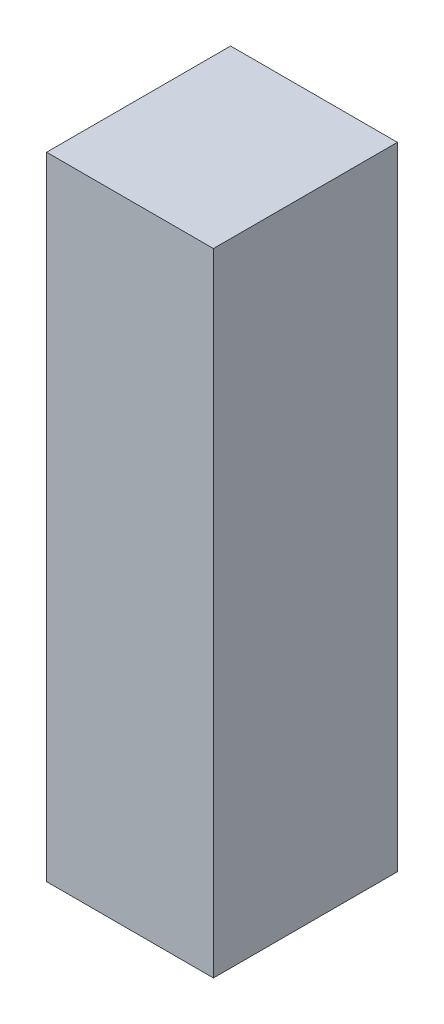
ISO-10303-21;
HEADER;
FILE_DESCRIPTION(('STEP AP214'),'2;1');
FILE_NAME('part.step','',(''),(''),'','','');
FILE_SCHEMA(('AUTOMOTIVE_DESIGN { 1 0 10303 214 1 1 1 1 }'));
ENDSEC;
DATA;
#1=APPLICATION_CONTEXT('core data for automotive mechanical design processes');
#2=APPLICATION_PROTOCOL_DEFINITION('international standard','automotive_design',2000,#1);
#3=PRODUCT_CONTEXT('',#1,'mechanical');
#4=PRODUCT('Part','Part','',(#3));
#5=PRODUCT_RELATED_PRODUCT_CATEGORY('part','',(#4));
#6=PRODUCT_DEFINITION_FORMATION('','',#4);
#7=PRODUCT_DEFINITION_CONTEXT('part definition',#1,'design');
#8=PRODUCT_DEFINITION('design','',#6,#7);
#9=PRODUCT_DEFINITION_SHAPE('','',#8);
#10=(LENGTH_UNIT() NAMED_UNIT(*) SI_UNIT(.MILLI.,.METRE.));
#11=(NAMED_UNIT(*) PLANE_ANGLE_UNIT() SI_UNIT($,.RADIAN.));
#12=(NAMED_UNIT(*) SI_UNIT($,.STERADIAN.) SOLID_ANGLE_UNIT());
#13=UNCERTAINTY_MEASURE_WITH_UNIT(LENGTH_MEASURE(1.E-05),#10,'distance_accuracy_value','');
#14=(GEOMETRIC_REPRESENTATION_CONTEXT(3) GLOBAL_UNCERTAINTY_ASSIGNED_CONTEXT((#13)) GLOBAL_UNIT_ASSIGNED_CONTEXT((#10,
#11,#12)) REPRESENTATION_CONTEXT('',''));
#15=CARTESIAN_POINT('',(0.,0.,0.));
#16=DIRECTION('',(0.,0.,1.));
#17=DIRECTION('',(1.,0.,0.));
#18=AXIS2_PLACEMENT_3D('',#15,#16,#17);
#19=CARTESIAN_POINT('',(107.3500013524,41.8789091554,102.779430458));
#20=DIRECTION('',(0.,0.,-1.));
#21=DIRECTION('',(-1.,0.,0.));
#22=AXIS2_PLACEMENT_3D('',#19,#20,#21);
#23=PLANE('',#22);
#24=DIRECTION('',(1.,0.,0.));
#25=VECTOR('',#24,1.);
#26=CARTESIAN_POINT('',(106.6947078319,46.8419278552,102.779430458));
#27=LINE('',#26,#25);
#28=CARTESIAN_POINT('',(106.0394143114,46.8419278552,102.779430458));
#29=VERTEX_POINT('',#28);
#30=CARTESIAN_POINT('',(107.3500013524,46.8419278552,102.779430458));
#31=VERTEX_POINT('',#30);
#32=EDGE_CURVE('E56',#29,#31,#27,.T.);
#33=ORIENTED_EDGE('',*,*,#32,.T.);
#34=DIRECTION('',(0.,1.,0.));
#35=VECTOR('',#34,1.);
#36=CARTESIAN_POINT('',(107.3500013524,44.3604185053,102.779430458));
#37=LINE('',#36,#35);
#38=CARTESIAN_POINT('',(107.3500013524,41.8789091554,102.779430458));
#39=VERTEX_POINT('',#38);
#40=EDGE_CURVE('E61',#39,#31,#37,.T.);
#41=ORIENTED_EDGE('',*,*,#40,.F.);
#42=DIRECTION('',(-1.,0.,0.));
#43=VECTOR('',#42,1.);
#44=CARTESIAN_POINT('',(106.6947078319,41.8789091554,102.779430458));
#45=LINE('',#44,#43);
#46=CARTESIAN_POINT('',(106.0394143114,41.8789091554,102.779430458));
#47=VERTEX_POINT('',#46);
#48=EDGE_CURVE('E21',#39,#47,#45,.T.);
#49=ORIENTED_EDGE('',*,*,#48,.T.);
#50=DIRECTION('',(0.,-1.,0.));
#51=VECTOR('',#50,1.);
#52=CARTESIAN_POINT('',(106.0394143114,44.3604185053,102.779430458));
#53=LINE('',#52,#51);
#54=EDGE_CURVE('E77',#29,#47,#53,.T.);
#55=ORIENTED_EDGE('',*,*,#54,.F.);
#56=EDGE_LOOP('',(#33,#41,#49,#55));
#57=FACE_BOUND('',#56,.T.);
#58=ADVANCED_FACE('F17',(#57),#23,.T.);
#59=CARTESIAN_POINT('',(107.3500013524,41.8789091554,104.224839683));
#60=DIRECTION('',(1.,0.,0.));
#61=DIRECTION('',(0.,0.,-1.));
#62=AXIS2_PLACEMENT_3D('',#59,#60,#61);
#63=PLANE('',#62);
#64=DIRECTION('',(0.,0.,1.));
#65=VECTOR('',#64,1.);
#66=CARTESIAN_POINT('',(107.3500013524,46.8419278552,103.5021350705));
#67=LINE('',#66,#65);
#68=CARTESIAN_POINT('',(107.3500013524,46.8419278552,104.224839683));
#69=VERTEX_POINT('',#68);
#70=EDGE_CURVE('E71',#31,#69,#67,.T.);
#71=ORIENTED_EDGE('',*,*,#70,.T.);
#72=DIRECTION('',(0.,1.,0.));
#73=VECTOR('',#72,1.);
#74=CARTESIAN_POINT('',(107.3500013524,44.3604185053,104.224839683));
#75=LINE('',#74,#73);
#76=CARTESIAN_POINT('',(107.3500013524,41.8789091554,104.224839683));
#77=VERTEX_POINT('',#76);
#78=EDGE_CURVE('E67',#77,#69,#75,.T.);
#79=ORIENTED_EDGE('',*,*,#78,.F.);
#80=DIRECTION('',(0.,0.,-1.));
#81=VECTOR('',#80,1.);
#82=CARTESIAN_POINT('',(107.3500013524,41.8789091554,103.5021350705));
#83=LINE('',#82,#81);
#84=EDGE_CURVE('E35',#77,#39,#83,.T.);
#85=ORIENTED_EDGE('',*,*,#84,.T.);
#86=ORIENTED_EDGE('',*,*,#40,.T.);
#87=EDGE_LOOP('',(#71,#79,#85,#86));
#88=FACE_BOUND('',#87,.T.);
#89=ADVANCED_FACE('F65',(#88),#63,.T.);
#90=CARTESIAN_POINT('',(106.0394143114,46.8419278552,102.779430458));
#91=DIRECTION('',(0.,-1.,0.));
#92=DIRECTION('',(1.,0.,0.));
#93=AXIS2_PLACEMENT_3D('',#90,#91,#92);
#94=PLANE('',#93);
#95=ORIENTED_EDGE('',*,*,#32,.F.);
#96=DIRECTION('',(0.,0.,-1.));
#97=VECTOR('',#96,1.);
#98=CARTESIAN_POINT('',(106.0394143114,46.8419278552,103.5021350705));
#99=LINE('',#98,#97);
#100=CARTESIAN_POINT('',(106.0394143114,46.8419278552,104.224839683));
#101=VERTEX_POINT('',#100);
#102=EDGE_CURVE('E74',#101,#29,#99,.T.);
#103=ORIENTED_EDGE('',*,*,#102,.F.);
#104=DIRECTION('',(-1.,0.,0.));
#105=VECTOR('',#104,1.);
#106=CARTESIAN_POINT('',(106.6947078319,46.8419278552,104.224839683));
#107=LINE('',#106,#105);
#108=EDGE_CURVE('E80',#69,#101,#107,.T.);
#109=ORIENTED_EDGE('',*,*,#108,.F.);
#110=ORIENTED_EDGE('',*,*,#70,.F.);
#111=EDGE_LOOP('',(#95,#103,#109,#110));
#112=FACE_BOUND('',#111,.T.);
#113=ADVANCED_FACE('F91',(#112),#94,.F.);
#114=CARTESIAN_POINT('',(106.0394143114,41.8789091554,102.779430458));
#115=DIRECTION('',(-1.,0.,0.));
#116=DIRECTION('',(0.,0.,1.));
#117=AXIS2_PLACEMENT_3D('',#114,#115,#116);
#118=PLANE('',#117);
#119=ORIENTED_EDGE('',*,*,#102,.T.);
#120=ORIENTED_EDGE('',*,*,#54,.T.);
#121=DIRECTION('',(0.,0.,1.));
#122=VECTOR('',#121,1.);
#123=CARTESIAN_POINT('',(106.0394143114,41.8789091554,103.5021350705));
#124=LINE('',#123,#122);
#125=CARTESIAN_POINT('',(106.0394143114,41.8789091554,104.224839683));
#126=VERTEX_POINT('',#125);
#127=EDGE_CURVE('E59',#47,#126,#124,.T.);
#128=ORIENTED_EDGE('',*,*,#127,.T.);
#129=DIRECTION('',(0.,-1.,0.));
#130=VECTOR('',#129,1.);
#131=CARTESIAN_POINT('',(106.0394143114,44.3604185053,104.224839683));
#132=LINE('',#131,#130);
#133=EDGE_CURVE('E27',#101,#126,#132,.T.);
#134=ORIENTED_EDGE('',*,*,#133,.F.);
#135=EDGE_LOOP('',(#119,#120,#128,#134));
#136=FACE_BOUND('',#135,.T.);
#137=ADVANCED_FACE('F89',(#136),#118,.T.);
#138=CARTESIAN_POINT('',(106.0394143114,41.8789091554,104.224839683));
#139=DIRECTION('',(0.,0.,1.));
#140=DIRECTION('',(1.,0.,0.));
#141=AXIS2_PLACEMENT_3D('',#138,#139,#140);
#142=PLANE('',#141);
#143=ORIENTED_EDGE('',*,*,#108,.T.);
#144=ORIENTED_EDGE('',*,*,#133,.T.);
#145=DIRECTION('',(-1.,0.,0.));
#146=VECTOR('',#145,1.);
#147=CARTESIAN_POINT('',(106.6947078319,41.8789091554,104.224839683));
#148=LINE('',#147,#146);
#149=EDGE_CURVE('E11',#77,#126,#148,.T.);
#150=ORIENTED_EDGE('',*,*,#149,.F.);
#151=ORIENTED_EDGE('',*,*,#78,.T.);
#152=EDGE_LOOP('',(#143,#144,#150,#151));
#153=FACE_BOUND('',#152,.T.);
#154=ADVANCED_FACE('F86',(#153),#142,.T.);
#155=CARTESIAN_POINT('',(106.0394143114,41.8789091554,104.224839683));
#156=DIRECTION('',(0.,-1.,0.));
#157=DIRECTION('',(0.,0.,-1.));
#158=AXIS2_PLACEMENT_3D('',#155,#156,#157);
#159=PLANE('',#158);
#160=ORIENTED_EDGE('',*,*,#84,.F.);
#161=ORIENTED_EDGE('',*,*,#149,.T.);
#162=ORIENTED_EDGE('',*,*,#127,.F.);
#163=ORIENTED_EDGE('',*,*,#48,.F.);
#164=EDGE_LOOP('',(#160,#161,#162,#163));
#165=FACE_BOUND('',#164,.T.);
#166=ADVANCED_FACE('F19',(#165),#159,.T.);
#167=CLOSED_SHELL('',(#58,#89,#113,#137,#154,#166));
#168=MANIFOLD_SOLID_BREP('B1',#167);
#169=ADVANCED_BREP_SHAPE_REPRESENTATION('',(#18,#168),#14);
#170=SHAPE_DEFINITION_REPRESENTATION(#9,#169);
ENDSEC;
END-ISO-10303-21;
